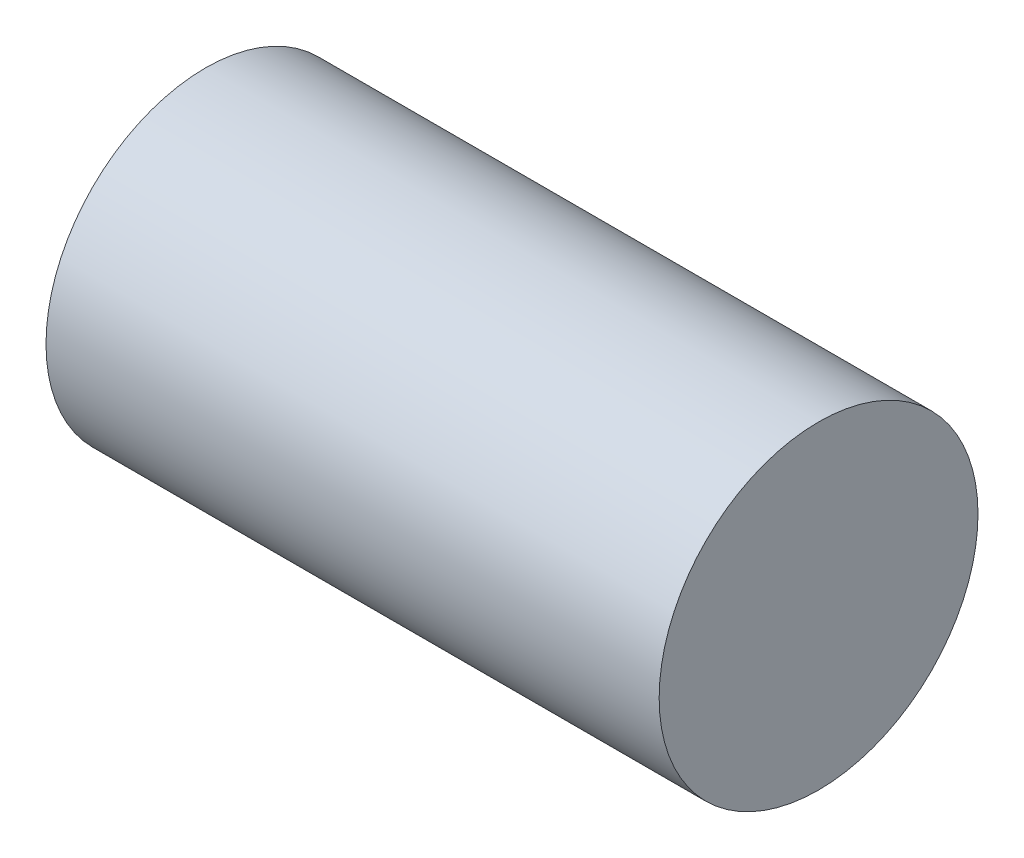
ISO-10303-21;
HEADER;
FILE_DESCRIPTION(('STEP AP214'),'2;1');
FILE_NAME('part.step','',(''),(''),'','','');
FILE_SCHEMA(('AUTOMOTIVE_DESIGN { 1 0 10303 214 1 1 1 1 }'));
ENDSEC;
DATA;
#1=APPLICATION_CONTEXT('core data for automotive mechanical design processes');
#2=APPLICATION_PROTOCOL_DEFINITION('international standard','automotive_design',2000,#1);
#3=PRODUCT_CONTEXT('',#1,'mechanical');
#4=PRODUCT('Part','Part','',(#3));
#5=PRODUCT_RELATED_PRODUCT_CATEGORY('part','',(#4));
#6=PRODUCT_DEFINITION_FORMATION('','',#4);
#7=PRODUCT_DEFINITION_CONTEXT('part definition',#1,'design');
#8=PRODUCT_DEFINITION('design','',#6,#7);
#9=PRODUCT_DEFINITION_SHAPE('','',#8);
#10=(LENGTH_UNIT() NAMED_UNIT(*) SI_UNIT(.MILLI.,.METRE.));
#11=(NAMED_UNIT(*) PLANE_ANGLE_UNIT() SI_UNIT($,.RADIAN.));
#12=(NAMED_UNIT(*) SI_UNIT($,.STERADIAN.) SOLID_ANGLE_UNIT());
#13=UNCERTAINTY_MEASURE_WITH_UNIT(LENGTH_MEASURE(1.E-05),#10,'distance_accuracy_value','');
#14=(GEOMETRIC_REPRESENTATION_CONTEXT(3) GLOBAL_UNCERTAINTY_ASSIGNED_CONTEXT((#13)) GLOBAL_UNIT_ASSIGNED_CONTEXT((#10,
#11,#12)) REPRESENTATION_CONTEXT('',''));
#15=CARTESIAN_POINT('',(0.,0.,0.));
#16=DIRECTION('',(0.,0.,1.));
#17=DIRECTION('',(1.,0.,0.));
#18=AXIS2_PLACEMENT_3D('',#15,#16,#17);
#19=CARTESIAN_POINT('',(-100.,0.,0.));
#20=DIRECTION('',(1.,0.,0.));
#21=DIRECTION('',(0.,0.,-1.));
#22=AXIS2_PLACEMENT_3D('',#19,#20,#21);
#23=CYLINDRICAL_SURFACE('',#22,26.);
#24=CARTESIAN_POINT('',(-100.,0.,0.));
#25=DIRECTION('',(1.,0.,0.));
#26=DIRECTION('',(0.,0.,-1.));
#27=AXIS2_PLACEMENT_3D('',#24,#25,#26);
#28=CIRCLE('',#27,26.);
#29=CARTESIAN_POINT('',(-100.,0.,-26.));
#30=VERTEX_POINT('',#29);
#31=EDGE_CURVE('E10',#30,#30,#28,.T.);
#32=ORIENTED_EDGE('',*,*,#31,.T.);
#33=EDGE_LOOP('',(#32));
#34=FACE_BOUND('',#33,.T.);
#35=CARTESIAN_POINT('',(0.,0.,0.));
#36=DIRECTION('',(1.,0.,0.));
#37=DIRECTION('',(0.,0.,-1.));
#38=AXIS2_PLACEMENT_3D('',#35,#36,#37);
#39=CIRCLE('',#38,26.);
#40=CARTESIAN_POINT('',(0.,0.,-26.));
#41=VERTEX_POINT('',#40);
#42=EDGE_CURVE('E34',#41,#41,#39,.T.);
#43=ORIENTED_EDGE('',*,*,#42,.F.);
#44=EDGE_LOOP('',(#43));
#45=FACE_BOUND('',#44,.T.);
#46=ADVANCED_FACE('F31',(#34,#45),#23,.T.);
#47=CARTESIAN_POINT('',(-100.,0.,0.));
#48=DIRECTION('',(1.,0.,0.));
#49=DIRECTION('',(0.,0.,-1.));
#50=AXIS2_PLACEMENT_3D('',#47,#48,#49);
#51=PLANE('',#50);
#52=ORIENTED_EDGE('',*,*,#31,.F.);
#53=EDGE_LOOP('',(#52));
#54=FACE_BOUND('',#53,.T.);
#55=ADVANCED_FACE('F46',(#54),#51,.F.);
#56=CARTESIAN_POINT('',(0.,0.,0.));
#57=DIRECTION('',(1.,0.,0.));
#58=DIRECTION('',(0.,0.,-1.));
#59=AXIS2_PLACEMENT_3D('',#56,#57,#58);
#60=PLANE('',#59);
#61=ORIENTED_EDGE('',*,*,#42,.T.);
#62=EDGE_LOOP('',(#61));
#63=FACE_BOUND('',#62,.T.);
#64=ADVANCED_FACE('F43',(#63),#60,.T.);
#65=CLOSED_SHELL('',(#46,#55,#64));
#66=MANIFOLD_SOLID_BREP('B2',#65);
#67=ADVANCED_BREP_SHAPE_REPRESENTATION('',(#18,#66),#14);
#68=SHAPE_DEFINITION_REPRESENTATION(#9,#67);
ENDSEC;
END-ISO-10303-21;
